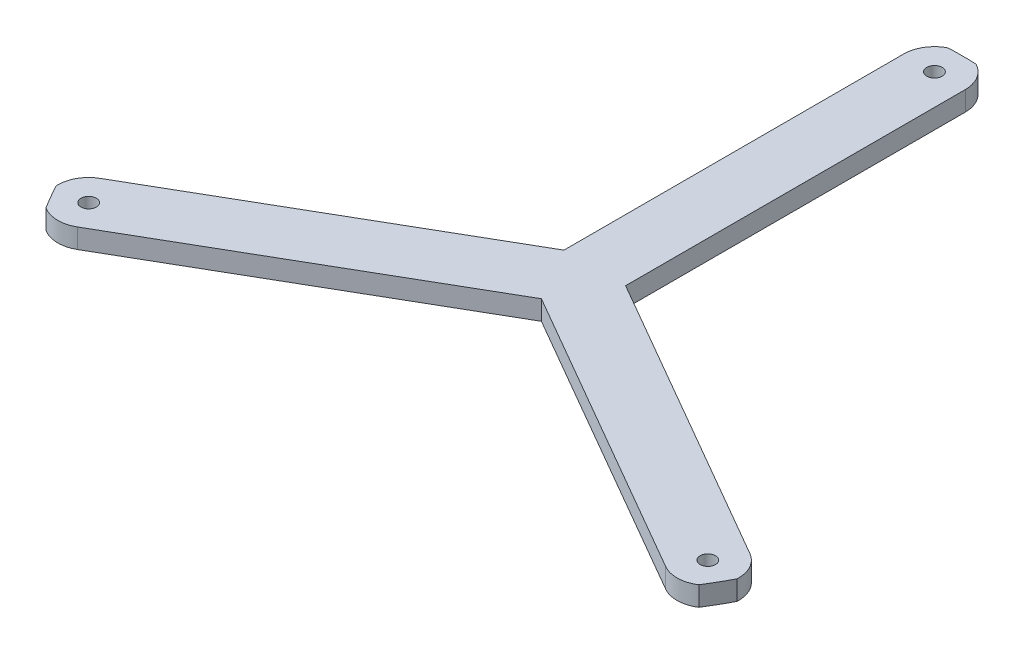
ISO-10303-21;
HEADER;
FILE_DESCRIPTION(('STEP AP214'),'2;1');
FILE_NAME('part.step','',(''),(''),'','','');
FILE_SCHEMA(('AUTOMOTIVE_DESIGN { 1 0 10303 214 1 1 1 1 }'));
ENDSEC;
DATA;
#1=APPLICATION_CONTEXT('core data for automotive mechanical design processes');
#2=APPLICATION_PROTOCOL_DEFINITION('international standard','automotive_design',2000,#1);
#3=PRODUCT_CONTEXT('',#1,'mechanical');
#4=PRODUCT('Part','Part','',(#3));
#5=PRODUCT_RELATED_PRODUCT_CATEGORY('part','',(#4));
#6=PRODUCT_DEFINITION_FORMATION('','',#4);
#7=PRODUCT_DEFINITION_CONTEXT('part definition',#1,'design');
#8=PRODUCT_DEFINITION('design','',#6,#7);
#9=PRODUCT_DEFINITION_SHAPE('','',#8);
#10=(LENGTH_UNIT() NAMED_UNIT(*) SI_UNIT(.MILLI.,.METRE.));
#11=(NAMED_UNIT(*) PLANE_ANGLE_UNIT() SI_UNIT($,.RADIAN.));
#12=(NAMED_UNIT(*) SI_UNIT($,.STERADIAN.) SOLID_ANGLE_UNIT());
#13=UNCERTAINTY_MEASURE_WITH_UNIT(LENGTH_MEASURE(1.E-05),#10,'distance_accuracy_value','');
#14=(GEOMETRIC_REPRESENTATION_CONTEXT(3) GLOBAL_UNCERTAINTY_ASSIGNED_CONTEXT((#13)) GLOBAL_UNIT_ASSIGNED_CONTEXT((#10,
#11,#12)) REPRESENTATION_CONTEXT('',''));
#15=CARTESIAN_POINT('',(0.,0.,0.));
#16=DIRECTION('',(0.,0.,1.));
#17=DIRECTION('',(1.,0.,0.));
#18=AXIS2_PLACEMENT_3D('',#15,#16,#17);
#19=CARTESIAN_POINT('',(0.,6.35,0.));
#20=DIRECTION('',(0.,-1.,0.));
#21=DIRECTION('',(0.,0.,-1.));
#22=AXIS2_PLACEMENT_3D('',#19,#20,#21);
#23=CYLINDRICAL_SURFACE('',#22,125.);
#24=DIRECTION('',(0.,1.,0.));
#25=VECTOR('',#24,1.);
#26=CARTESIAN_POINT('',(110.44429821998,-3.65,58.541070973259));
#27=LINE('',#26,#25);
#28=CARTESIAN_POINT('',(110.44429821998,0.,58.541070973259));
#29=VERTEX_POINT('',#28);
#30=CARTESIAN_POINT('',(110.44429821998,6.35,58.541070973259));
#31=VERTEX_POINT('',#30);
#32=EDGE_CURVE('E307',#29,#31,#27,.T.);
#33=ORIENTED_EDGE('',*,*,#32,.T.);
#34=CARTESIAN_POINT('',(0.,6.35,0.));
#35=DIRECTION('',(0.,1.,0.));
#36=DIRECTION('',(0.,0.,1.));
#37=AXIS2_PLACEMENT_3D('',#34,#35,#36);
#38=CIRCLE('',#37,125.);
#39=CARTESIAN_POINT('',(105.92020373756,6.35,66.3770324750498));
#40=VERTEX_POINT('',#39);
#41=EDGE_CURVE('E246',#40,#31,#38,.T.);
#42=ORIENTED_EDGE('',*,*,#41,.F.);
#43=DIRECTION('',(0.,1.,0.));
#44=VECTOR('',#43,1.);
#45=CARTESIAN_POINT('',(105.92020373756,-3.65,66.3770324750498));
#46=LINE('',#45,#44);
#47=CARTESIAN_POINT('',(105.92020373756,0.,66.3770324750498));
#48=VERTEX_POINT('',#47);
#49=EDGE_CURVE('E234',#48,#40,#46,.T.);
#50=ORIENTED_EDGE('',*,*,#49,.F.);
#51=CARTESIAN_POINT('',(0.,0.,0.));
#52=DIRECTION('',(0.,1.,0.));
#53=DIRECTION('',(0.,0.,1.));
#54=AXIS2_PLACEMENT_3D('',#51,#52,#53);
#55=CIRCLE('',#54,125.);
#56=EDGE_CURVE('E244',#48,#29,#55,.T.);
#57=ORIENTED_EDGE('',*,*,#56,.T.);
#58=EDGE_LOOP('',(#33,#42,#50,#57));
#59=FACE_BOUND('',#58,.T.);
#60=ADVANCED_FACE('F109',(#59),#23,.T.);
#61=DIRECTION('',(0.,1.,0.));
#62=VECTOR('',#61,1.);
#63=CARTESIAN_POINT('',(4.52409448241847,-3.65,-124.918103448276));
#64=LINE('',#63,#62);
#65=CARTESIAN_POINT('',(4.52409448241847,0.,-124.918103448276));
#66=VERTEX_POINT('',#65);
#67=CARTESIAN_POINT('',(4.52409448241847,6.35,-124.918103448276));
#68=VERTEX_POINT('',#67);
#69=EDGE_CURVE('E302',#66,#68,#64,.T.);
#70=ORIENTED_EDGE('',*,*,#69,.F.);
#71=CARTESIAN_POINT('',(-4.52409448241847,0.,-124.918103448276));
#72=VERTEX_POINT('',#71);
#73=EDGE_CURVE('E249',#66,#72,#55,.T.);
#74=ORIENTED_EDGE('',*,*,#73,.T.);
#75=DIRECTION('',(0.,1.,0.));
#76=VECTOR('',#75,1.);
#77=CARTESIAN_POINT('',(-4.52409448241847,-3.65,-124.918103448276));
#78=LINE('',#77,#76);
#79=CARTESIAN_POINT('',(-4.52409448241847,6.35,-124.918103448276));
#80=VERTEX_POINT('',#79);
#81=EDGE_CURVE('E324',#72,#80,#78,.T.);
#82=ORIENTED_EDGE('',*,*,#81,.T.);
#83=EDGE_CURVE('E243',#68,#80,#38,.T.);
#84=ORIENTED_EDGE('',*,*,#83,.F.);
#85=EDGE_LOOP('',(#70,#74,#82,#84));
#86=FACE_BOUND('',#85,.T.);
#87=ADVANCED_FACE('F365',(#86),#23,.T.);
#88=DIRECTION('',(0.,1.,0.));
#89=VECTOR('',#88,1.);
#90=CARTESIAN_POINT('',(-105.92020373759,-3.65,66.377032475001));
#91=LINE('',#90,#89);
#92=CARTESIAN_POINT('',(-105.92020373759,0.,66.377032475001));
#93=VERTEX_POINT('',#92);
#94=CARTESIAN_POINT('',(-105.92020373759,6.35,66.377032475001));
#95=VERTEX_POINT('',#94);
#96=EDGE_CURVE('E216',#93,#95,#91,.T.);
#97=ORIENTED_EDGE('',*,*,#96,.T.);
#98=CARTESIAN_POINT('',(-110.444298220006,6.35,58.5410709732088));
#99=VERTEX_POINT('',#98);
#100=EDGE_CURVE('E231',#99,#95,#38,.T.);
#101=ORIENTED_EDGE('',*,*,#100,.F.);
#102=DIRECTION('',(0.,1.,0.));
#103=VECTOR('',#102,1.);
#104=CARTESIAN_POINT('',(-110.444298220006,-3.65,58.5410709732088));
#105=LINE('',#104,#103);
#106=CARTESIAN_POINT('',(-110.444298220006,0.,58.5410709732088));
#107=VERTEX_POINT('',#106);
#108=EDGE_CURVE('E321',#107,#99,#105,.T.);
#109=ORIENTED_EDGE('',*,*,#108,.F.);
#110=EDGE_CURVE('E233',#107,#93,#55,.T.);
#111=ORIENTED_EDGE('',*,*,#110,.T.);
#112=EDGE_LOOP('',(#97,#101,#109,#111));
#113=FACE_BOUND('',#112,.T.);
#114=ADVANCED_FACE('F229',(#113),#23,.T.);
#115=CARTESIAN_POINT('',(0.,6.35,0.));
#116=DIRECTION('',(0.,1.,0.));
#117=DIRECTION('',(0.,0.,1.));
#118=AXIS2_PLACEMENT_3D('',#115,#116,#117);
#119=PLANE('',#118);
#120=CARTESIAN_POINT('',(0.,6.35,-116.));
#121=DIRECTION('',(0.,1.,0.));
#122=DIRECTION('',(0.,0.,1.));
#123=AXIS2_PLACEMENT_3D('',#120,#121,#122);
#124=CIRCLE('',#123,2.5);
#125=CARTESIAN_POINT('',(0.,6.35,-113.5));
#126=VERTEX_POINT('',#125);
#127=EDGE_CURVE('E335',#126,#126,#124,.T.);
#128=ORIENTED_EDGE('',*,*,#127,.F.);
#129=EDGE_LOOP('',(#128));
#130=FACE_BOUND('',#129,.T.);
#131=CARTESIAN_POINT('',(100.458946838986,6.35,58.0000000000153));
#132=DIRECTION('',(0.,1.,0.));
#133=DIRECTION('',(0.,0.,1.));
#134=AXIS2_PLACEMENT_3D('',#131,#132,#133);
#135=CIRCLE('',#134,2.5);
#136=CARTESIAN_POINT('',(100.458946838986,6.35,60.5000000000153));
#137=VERTEX_POINT('',#136);
#138=EDGE_CURVE('E338',#137,#137,#135,.T.);
#139=ORIENTED_EDGE('',*,*,#138,.F.);
#140=EDGE_LOOP('',(#139));
#141=FACE_BOUND('',#140,.T.);
#142=CARTESIAN_POINT('',(-100.458946839013,6.35,57.9999999999694));
#143=DIRECTION('',(0.,1.,0.));
#144=DIRECTION('',(0.,0.,1.));
#145=AXIS2_PLACEMENT_3D('',#142,#143,#144);
#146=CIRCLE('',#145,2.5);
#147=CARTESIAN_POINT('',(-100.458946839013,6.35,60.4999999999693));
#148=VERTEX_POINT('',#147);
#149=EDGE_CURVE('E344',#148,#148,#146,.T.);
#150=ORIENTED_EDGE('',*,*,#149,.F.);
#151=EDGE_LOOP('',(#150));
#152=FACE_BOUND('',#151,.T.);
#153=ORIENTED_EDGE('',*,*,#41,.T.);
#154=CARTESIAN_POINT('',(100.458946838986,6.35,58.0000000000153));
#155=DIRECTION('',(0.,1.,0.));
#156=DIRECTION('',(0.,0.,1.));
#157=AXIS2_PLACEMENT_3D('',#154,#155,#156);
#158=CIRCLE('',#157,10.);
#159=CARTESIAN_POINT('',(105.458946838987,6.35,49.3397459621717));
#160=VERTEX_POINT('',#159);
#161=EDGE_CURVE('E377',#31,#160,#158,.T.);
#162=ORIENTED_EDGE('',*,*,#161,.T.);
#163=DIRECTION('',(0.866025403784362,0.,0.500000000000132));
#164=VECTOR('',#163,1.);
#165=CARTESIAN_POINT('',(5.00000000000132,6.35,-8.66025403784362));
#166=LINE('',#165,#164);
#167=CARTESIAN_POINT('',(10.,6.35,-5.77350269189523));
#168=VERTEX_POINT('',#167);
#169=EDGE_CURVE('E310',#168,#160,#166,.T.);
#170=ORIENTED_EDGE('',*,*,#169,.F.);
#171=DIRECTION('',(0.,0.,1.));
#172=VECTOR('',#171,1.);
#173=CARTESIAN_POINT('',(10.,6.35,0.));
#174=LINE('',#173,#172);
#175=CARTESIAN_POINT('',(9.99999999999999,6.35,-116.));
#176=VERTEX_POINT('',#175);
#177=EDGE_CURVE('E298',#176,#168,#174,.T.);
#178=ORIENTED_EDGE('',*,*,#177,.F.);
#179=CARTESIAN_POINT('',(0.,6.35,-116.));
#180=DIRECTION('',(0.,1.,0.));
#181=DIRECTION('',(0.,0.,1.));
#182=AXIS2_PLACEMENT_3D('',#179,#180,#181);
#183=CIRCLE('',#182,9.99999999999999);
#184=EDGE_CURVE('E378',#176,#68,#183,.T.);
#185=ORIENTED_EDGE('',*,*,#184,.T.);
#186=ORIENTED_EDGE('',*,*,#83,.T.);
#187=CARTESIAN_POINT('',(0.,6.35,-116.));
#188=DIRECTION('',(0.,1.,0.));
#189=DIRECTION('',(0.,0.,1.));
#190=AXIS2_PLACEMENT_3D('',#187,#188,#189);
#191=CIRCLE('',#190,9.99999999999999);
#192=CARTESIAN_POINT('',(-9.99999999999999,6.35,-116.));
#193=VERTEX_POINT('',#192);
#194=EDGE_CURVE('E317',#80,#193,#191,.T.);
#195=ORIENTED_EDGE('',*,*,#194,.T.);
#196=DIRECTION('',(0.,0.,1.));
#197=VECTOR('',#196,1.);
#198=CARTESIAN_POINT('',(-9.99999999999998,6.35,0.));
#199=LINE('',#198,#197);
#200=CARTESIAN_POINT('',(-9.99999999999997,6.35,-5.7735026918983));
#201=VERTEX_POINT('',#200);
#202=EDGE_CURVE('E314',#193,#201,#199,.T.);
#203=ORIENTED_EDGE('',*,*,#202,.T.);
#204=DIRECTION('',(-0.866025403784591,0.,0.499999999999736));
#205=VECTOR('',#204,1.);
#206=CARTESIAN_POINT('',(-4.99999999999736,6.35,-8.66025403784591));
#207=LINE('',#206,#205);
#208=CARTESIAN_POINT('',(-105.45894683901,6.35,49.3397459621235));
#209=VERTEX_POINT('',#208);
#210=EDGE_CURVE('E312',#201,#209,#207,.T.);
#211=ORIENTED_EDGE('',*,*,#210,.T.);
#212=CARTESIAN_POINT('',(-100.458946839013,6.35,57.9999999999694));
#213=DIRECTION('',(0.,1.,0.));
#214=DIRECTION('',(0.,0.,1.));
#215=AXIS2_PLACEMENT_3D('',#212,#213,#214);
#216=CIRCLE('',#215,10.);
#217=EDGE_CURVE('E242',#209,#99,#216,.T.);
#218=ORIENTED_EDGE('',*,*,#217,.T.);
#219=ORIENTED_EDGE('',*,*,#100,.T.);
#220=CARTESIAN_POINT('',(-100.458946839013,6.35,57.9999999999694));
#221=DIRECTION('',(0.,1.,0.));
#222=DIRECTION('',(0.,0.,1.));
#223=AXIS2_PLACEMENT_3D('',#220,#221,#222);
#224=CIRCLE('',#223,10.);
#225=CARTESIAN_POINT('',(-95.4589468390152,6.35,66.6602540378153));
#226=VERTEX_POINT('',#225);
#227=EDGE_CURVE('E213',#95,#226,#224,.T.);
#228=ORIENTED_EDGE('',*,*,#227,.T.);
#229=DIRECTION('',(-0.866025403784591,0.,0.499999999999736));
#230=VECTOR('',#229,1.);
#231=CARTESIAN_POINT('',(4.99999999999736,6.35,8.66025403784592));
#232=LINE('',#231,#230);
#233=CARTESIAN_POINT('',(-2.63461127913978E-12,6.35,11.547005383792));
#234=VERTEX_POINT('',#233);
#235=EDGE_CURVE('E235',#234,#226,#232,.T.);
#236=ORIENTED_EDGE('',*,*,#235,.F.);
#237=DIRECTION('',(0.866025403784362,0.,0.500000000000132));
#238=VECTOR('',#237,1.);
#239=CARTESIAN_POINT('',(-5.00000000000132,6.35,8.66025403784362));
#240=LINE('',#239,#238);
#241=CARTESIAN_POINT('',(95.4589468389847,6.35,66.6602540378589));
#242=VERTEX_POINT('',#241);
#243=EDGE_CURVE('E409',#234,#242,#240,.T.);
#244=ORIENTED_EDGE('',*,*,#243,.T.);
#245=CARTESIAN_POINT('',(100.458946838986,6.35,58.0000000000153));
#246=DIRECTION('',(0.,1.,0.));
#247=DIRECTION('',(0.,0.,1.));
#248=AXIS2_PLACEMENT_3D('',#245,#246,#247);
#249=CIRCLE('',#248,10.);
#250=EDGE_CURVE('E224',#242,#40,#249,.T.);
#251=ORIENTED_EDGE('',*,*,#250,.T.);
#252=EDGE_LOOP('',(#153,#162,#170,#178,#185,#186,#195,#203,#211,#218,#219,#228,#236,#244,#251));
#253=FACE_BOUND('',#252,.T.);
#254=ADVANCED_FACE('F239',(#130,#141,#152,#253),#119,.T.);
#255=CARTESIAN_POINT('',(0.,0.,0.));
#256=DIRECTION('',(0.,1.,0.));
#257=DIRECTION('',(0.,0.,1.));
#258=AXIS2_PLACEMENT_3D('',#255,#256,#257);
#259=PLANE('',#258);
#260=CARTESIAN_POINT('',(-100.458946839013,0.,57.9999999999694));
#261=DIRECTION('',(0.,1.,0.));
#262=DIRECTION('',(0.,0.,1.));
#263=AXIS2_PLACEMENT_3D('',#260,#261,#262);
#264=CIRCLE('',#263,2.5);
#265=CARTESIAN_POINT('',(-100.458946839013,0.,60.4999999999693));
#266=VERTEX_POINT('',#265);
#267=EDGE_CURVE('E323',#266,#266,#264,.T.);
#268=ORIENTED_EDGE('',*,*,#267,.T.);
#269=EDGE_LOOP('',(#268));
#270=FACE_BOUND('',#269,.T.);
#271=CARTESIAN_POINT('',(100.458946838986,0.,58.0000000000153));
#272=DIRECTION('',(0.,1.,0.));
#273=DIRECTION('',(0.,0.,1.));
#274=AXIS2_PLACEMENT_3D('',#271,#272,#273);
#275=CIRCLE('',#274,2.5);
#276=CARTESIAN_POINT('',(100.458946838986,0.,60.5000000000153));
#277=VERTEX_POINT('',#276);
#278=EDGE_CURVE('E341',#277,#277,#275,.T.);
#279=ORIENTED_EDGE('',*,*,#278,.T.);
#280=EDGE_LOOP('',(#279));
#281=FACE_BOUND('',#280,.T.);
#282=CARTESIAN_POINT('',(0.,0.,-116.));
#283=DIRECTION('',(0.,1.,0.));
#284=DIRECTION('',(0.,0.,1.));
#285=AXIS2_PLACEMENT_3D('',#282,#283,#284);
#286=CIRCLE('',#285,2.5);
#287=CARTESIAN_POINT('',(0.,0.,-113.5));
#288=VERTEX_POINT('',#287);
#289=EDGE_CURVE('E332',#288,#288,#286,.T.);
#290=ORIENTED_EDGE('',*,*,#289,.T.);
#291=EDGE_LOOP('',(#290));
#292=FACE_BOUND('',#291,.T.);
#293=CARTESIAN_POINT('',(100.458946838986,0.,58.0000000000153));
#294=DIRECTION('',(0.,1.,0.));
#295=DIRECTION('',(0.,0.,1.));
#296=AXIS2_PLACEMENT_3D('',#293,#294,#295);
#297=CIRCLE('',#296,10.);
#298=CARTESIAN_POINT('',(105.458946838987,0.,49.3397459621717));
#299=VERTEX_POINT('',#298);
#300=EDGE_CURVE('E12',#29,#299,#297,.T.);
#301=ORIENTED_EDGE('',*,*,#300,.F.);
#302=ORIENTED_EDGE('',*,*,#56,.F.);
#303=CARTESIAN_POINT('',(100.458946838986,0.,58.0000000000153));
#304=DIRECTION('',(0.,1.,0.));
#305=DIRECTION('',(0.,0.,1.));
#306=AXIS2_PLACEMENT_3D('',#303,#304,#305);
#307=CIRCLE('',#306,10.);
#308=CARTESIAN_POINT('',(95.4589468389847,0.,66.6602540378589));
#309=VERTEX_POINT('',#308);
#310=EDGE_CURVE('E268',#309,#48,#307,.T.);
#311=ORIENTED_EDGE('',*,*,#310,.F.);
#312=DIRECTION('',(0.866025403784362,0.,0.500000000000132));
#313=VECTOR('',#312,1.);
#314=CARTESIAN_POINT('',(-5.00000000000132,0.,8.66025403784362));
#315=LINE('',#314,#313);
#316=CARTESIAN_POINT('',(-2.63461127913978E-12,0.,11.547005383792));
#317=VERTEX_POINT('',#316);
#318=EDGE_CURVE('E270',#317,#309,#315,.T.);
#319=ORIENTED_EDGE('',*,*,#318,.F.);
#320=DIRECTION('',(-0.866025403784591,0.,0.499999999999736));
#321=VECTOR('',#320,1.);
#322=CARTESIAN_POINT('',(4.99999999999736,0.,8.66025403784592));
#323=LINE('',#322,#321);
#324=CARTESIAN_POINT('',(-95.4589468390152,0.,66.6602540378153));
#325=VERTEX_POINT('',#324);
#326=EDGE_CURVE('E272',#317,#325,#323,.T.);
#327=ORIENTED_EDGE('',*,*,#326,.T.);
#328=CARTESIAN_POINT('',(-100.458946839013,0.,57.9999999999694));
#329=DIRECTION('',(0.,1.,0.));
#330=DIRECTION('',(0.,0.,1.));
#331=AXIS2_PLACEMENT_3D('',#328,#329,#330);
#332=CIRCLE('',#331,10.);
#333=EDGE_CURVE('E275',#93,#325,#332,.T.);
#334=ORIENTED_EDGE('',*,*,#333,.F.);
#335=ORIENTED_EDGE('',*,*,#110,.F.);
#336=CARTESIAN_POINT('',(-100.458946839013,0.,57.9999999999694));
#337=DIRECTION('',(0.,1.,0.));
#338=DIRECTION('',(0.,0.,1.));
#339=AXIS2_PLACEMENT_3D('',#336,#337,#338);
#340=CIRCLE('',#339,10.);
#341=CARTESIAN_POINT('',(-105.45894683901,0.,49.3397459621235));
#342=VERTEX_POINT('',#341);
#343=EDGE_CURVE('E266',#342,#107,#340,.T.);
#344=ORIENTED_EDGE('',*,*,#343,.F.);
#345=DIRECTION('',(-0.866025403784591,0.,0.499999999999736));
#346=VECTOR('',#345,1.);
#347=CARTESIAN_POINT('',(-4.99999999999736,0.,-8.66025403784591));
#348=LINE('',#347,#346);
#349=CARTESIAN_POINT('',(-9.99999999999997,0.,-5.7735026918983));
#350=VERTEX_POINT('',#349);
#351=EDGE_CURVE('E252',#350,#342,#348,.T.);
#352=ORIENTED_EDGE('',*,*,#351,.F.);
#353=DIRECTION('',(0.,0.,1.));
#354=VECTOR('',#353,1.);
#355=CARTESIAN_POINT('',(-9.99999999999998,0.,0.));
#356=LINE('',#355,#354);
#357=CARTESIAN_POINT('',(-9.99999999999999,0.,-116.));
#358=VERTEX_POINT('',#357);
#359=EDGE_CURVE('E256',#358,#350,#356,.T.);
#360=ORIENTED_EDGE('',*,*,#359,.F.);
#361=CARTESIAN_POINT('',(0.,0.,-116.));
#362=DIRECTION('',(0.,1.,0.));
#363=DIRECTION('',(0.,0.,1.));
#364=AXIS2_PLACEMENT_3D('',#361,#362,#363);
#365=CIRCLE('',#364,9.99999999999999);
#366=EDGE_CURVE('E262',#72,#358,#365,.T.);
#367=ORIENTED_EDGE('',*,*,#366,.F.);
#368=ORIENTED_EDGE('',*,*,#73,.F.);
#369=CARTESIAN_POINT('',(0.,0.,-116.));
#370=DIRECTION('',(0.,1.,0.));
#371=DIRECTION('',(0.,0.,1.));
#372=AXIS2_PLACEMENT_3D('',#369,#370,#371);
#373=CIRCLE('',#372,9.99999999999999);
#374=CARTESIAN_POINT('',(9.99999999999999,0.,-116.));
#375=VERTEX_POINT('',#374);
#376=EDGE_CURVE('E277',#375,#66,#373,.T.);
#377=ORIENTED_EDGE('',*,*,#376,.F.);
#378=DIRECTION('',(0.,0.,1.));
#379=VECTOR('',#378,1.);
#380=CARTESIAN_POINT('',(10.,0.,0.));
#381=LINE('',#380,#379);
#382=CARTESIAN_POINT('',(10.,0.,-5.77350269189523));
#383=VERTEX_POINT('',#382);
#384=EDGE_CURVE('E279',#375,#383,#381,.T.);
#385=ORIENTED_EDGE('',*,*,#384,.T.);
#386=DIRECTION('',(0.866025403784362,0.,0.500000000000132));
#387=VECTOR('',#386,1.);
#388=CARTESIAN_POINT('',(5.00000000000132,0.,-8.66025403784362));
#389=LINE('',#388,#387);
#390=EDGE_CURVE('E116',#383,#299,#389,.T.);
#391=ORIENTED_EDGE('',*,*,#390,.T.);
#392=EDGE_LOOP('',(#301,#302,#311,#319,#327,#334,#335,#344,#352,#360,#367,#368,#377,#385,#391));
#393=FACE_BOUND('',#392,.T.);
#394=ADVANCED_FACE('F284',(#270,#281,#292,#393),#259,.F.);
#395=CARTESIAN_POINT('',(-100.458946839013,0.,57.9999999999694));
#396=DIRECTION('',(0.,1.,0.));
#397=DIRECTION('',(0.,0.,1.));
#398=AXIS2_PLACEMENT_3D('',#395,#396,#397);
#399=CYLINDRICAL_SURFACE('',#398,2.5);
#400=ORIENTED_EDGE('',*,*,#267,.F.);
#401=EDGE_LOOP('',(#400));
#402=FACE_BOUND('',#401,.T.);
#403=ORIENTED_EDGE('',*,*,#149,.T.);
#404=EDGE_LOOP('',(#403));
#405=FACE_BOUND('',#404,.T.);
#406=ADVANCED_FACE('F351',(#402,#405),#399,.F.);
#407=CARTESIAN_POINT('',(100.458946838986,0.,58.0000000000153));
#408=DIRECTION('',(0.,1.,0.));
#409=DIRECTION('',(0.,0.,1.));
#410=AXIS2_PLACEMENT_3D('',#407,#408,#409);
#411=CYLINDRICAL_SURFACE('',#410,2.5);
#412=ORIENTED_EDGE('',*,*,#278,.F.);
#413=EDGE_LOOP('',(#412));
#414=FACE_BOUND('',#413,.T.);
#415=ORIENTED_EDGE('',*,*,#138,.T.);
#416=EDGE_LOOP('',(#415));
#417=FACE_BOUND('',#416,.T.);
#418=ADVANCED_FACE('F354',(#414,#417),#411,.F.);
#419=CARTESIAN_POINT('',(0.,0.,-116.));
#420=DIRECTION('',(0.,1.,0.));
#421=DIRECTION('',(0.,0.,1.));
#422=AXIS2_PLACEMENT_3D('',#419,#420,#421);
#423=CYLINDRICAL_SURFACE('',#422,2.5);
#424=ORIENTED_EDGE('',*,*,#289,.F.);
#425=EDGE_LOOP('',(#424));
#426=FACE_BOUND('',#425,.T.);
#427=ORIENTED_EDGE('',*,*,#127,.T.);
#428=EDGE_LOOP('',(#427));
#429=FACE_BOUND('',#428,.T.);
#430=ADVANCED_FACE('F447',(#426,#429),#423,.F.);
#431=CARTESIAN_POINT('',(-100.458946839013,-3.65,57.9999999999694));
#432=DIRECTION('',(0.,1.,0.));
#433=DIRECTION('',(0.,0.,1.));
#434=AXIS2_PLACEMENT_3D('',#431,#432,#433);
#435=CYLINDRICAL_SURFACE('',#434,10.);
#436=ORIENTED_EDGE('',*,*,#343,.T.);
#437=ORIENTED_EDGE('',*,*,#108,.T.);
#438=ORIENTED_EDGE('',*,*,#217,.F.);
#439=DIRECTION('',(0.,1.,0.));
#440=VECTOR('',#439,1.);
#441=CARTESIAN_POINT('',(-105.45894683901,-3.65,49.3397459621235));
#442=LINE('',#441,#440);
#443=EDGE_CURVE('E320',#342,#209,#442,.T.);
#444=ORIENTED_EDGE('',*,*,#443,.F.);
#445=EDGE_LOOP('',(#436,#437,#438,#444));
#446=FACE_BOUND('',#445,.T.);
#447=ADVANCED_FACE('F402',(#446),#435,.T.);
#448=CARTESIAN_POINT('',(0.,-3.65,-116.));
#449=DIRECTION('',(0.,1.,0.));
#450=DIRECTION('',(0.,0.,1.));
#451=AXIS2_PLACEMENT_3D('',#448,#449,#450);
#452=CYLINDRICAL_SURFACE('',#451,9.99999999999999);
#453=ORIENTED_EDGE('',*,*,#366,.T.);
#454=DIRECTION('',(0.,1.,0.));
#455=VECTOR('',#454,1.);
#456=CARTESIAN_POINT('',(-9.99999999999999,-3.65,-116.));
#457=LINE('',#456,#455);
#458=EDGE_CURVE('E327',#358,#193,#457,.T.);
#459=ORIENTED_EDGE('',*,*,#458,.T.);
#460=ORIENTED_EDGE('',*,*,#194,.F.);
#461=ORIENTED_EDGE('',*,*,#81,.F.);
#462=EDGE_LOOP('',(#453,#459,#460,#461));
#463=FACE_BOUND('',#462,.T.);
#464=ADVANCED_FACE('F392',(#463),#452,.T.);
#465=CARTESIAN_POINT('',(-9.99999999999998,-3.65,0.));
#466=DIRECTION('',(-1.,0.,0.));
#467=DIRECTION('',(0.,0.,1.));
#468=AXIS2_PLACEMENT_3D('',#465,#466,#467);
#469=PLANE('',#468);
#470=ORIENTED_EDGE('',*,*,#359,.T.);
#471=DIRECTION('',(0.,1.,0.));
#472=VECTOR('',#471,1.);
#473=CARTESIAN_POINT('',(-9.99999999999997,-3.65,-5.7735026918983));
#474=LINE('',#473,#472);
#475=EDGE_CURVE('E329',#350,#201,#474,.T.);
#476=ORIENTED_EDGE('',*,*,#475,.T.);
#477=ORIENTED_EDGE('',*,*,#202,.F.);
#478=ORIENTED_EDGE('',*,*,#458,.F.);
#479=EDGE_LOOP('',(#470,#476,#477,#478));
#480=FACE_BOUND('',#479,.T.);
#481=ADVANCED_FACE('F397',(#480),#469,.T.);
#482=CARTESIAN_POINT('',(-4.99999999999736,-3.65,-8.66025403784591));
#483=DIRECTION('',(-0.499999999999736,0.,-0.866025403784591));
#484=DIRECTION('',(-0.866025403784591,0.,0.499999999999736));
#485=AXIS2_PLACEMENT_3D('',#482,#483,#484);
#486=PLANE('',#485);
#487=ORIENTED_EDGE('',*,*,#351,.T.);
#488=ORIENTED_EDGE('',*,*,#443,.T.);
#489=ORIENTED_EDGE('',*,*,#210,.F.);
#490=ORIENTED_EDGE('',*,*,#475,.F.);
#491=EDGE_LOOP('',(#487,#488,#489,#490));
#492=FACE_BOUND('',#491,.T.);
#493=ADVANCED_FACE('F400',(#492),#486,.T.);
#494=CARTESIAN_POINT('',(-100.458946839013,-3.65,57.9999999999694));
#495=DIRECTION('',(0.,1.,0.));
#496=DIRECTION('',(0.,0.,1.));
#497=AXIS2_PLACEMENT_3D('',#494,#495,#496);
#498=CYLINDRICAL_SURFACE('',#497,10.);
#499=ORIENTED_EDGE('',*,*,#333,.T.);
#500=DIRECTION('',(0.,1.,0.));
#501=VECTOR('',#500,1.);
#502=CARTESIAN_POINT('',(-95.4589468390152,-3.65,66.6602540378153));
#503=LINE('',#502,#501);
#504=EDGE_CURVE('E219',#325,#226,#503,.T.);
#505=ORIENTED_EDGE('',*,*,#504,.T.);
#506=ORIENTED_EDGE('',*,*,#227,.F.);
#507=ORIENTED_EDGE('',*,*,#96,.F.);
#508=EDGE_LOOP('',(#499,#505,#506,#507));
#509=FACE_BOUND('',#508,.T.);
#510=ADVANCED_FACE('F215',(#509),#498,.T.);
#511=CARTESIAN_POINT('',(4.99999999999736,-3.65,8.66025403784592));
#512=DIRECTION('',(-0.499999999999736,0.,-0.866025403784591));
#513=DIRECTION('',(-0.866025403784591,0.,0.499999999999736));
#514=AXIS2_PLACEMENT_3D('',#511,#512,#513);
#515=PLANE('',#514);
#516=DIRECTION('',(0.,1.,0.));
#517=VECTOR('',#516,1.);
#518=CARTESIAN_POINT('',(-2.63461127913978E-12,-3.65,11.547005383792));
#519=LINE('',#518,#517);
#520=EDGE_CURVE('E382',#317,#234,#519,.T.);
#521=ORIENTED_EDGE('',*,*,#520,.T.);
#522=ORIENTED_EDGE('',*,*,#235,.T.);
#523=ORIENTED_EDGE('',*,*,#504,.F.);
#524=ORIENTED_EDGE('',*,*,#326,.F.);
#525=EDGE_LOOP('',(#521,#522,#523,#524));
#526=FACE_BOUND('',#525,.T.);
#527=ADVANCED_FACE('F405',(#526),#515,.F.);
#528=CARTESIAN_POINT('',(-5.00000000000132,-3.65,8.66025403784362));
#529=DIRECTION('',(-0.500000000000132,0.,0.866025403784363));
#530=DIRECTION('',(0.866025403784362,0.,0.500000000000132));
#531=AXIS2_PLACEMENT_3D('',#528,#529,#530);
#532=PLANE('',#531);
#533=ORIENTED_EDGE('',*,*,#318,.T.);
#534=DIRECTION('',(0.,1.,0.));
#535=VECTOR('',#534,1.);
#536=CARTESIAN_POINT('',(95.4589468389847,-3.65,66.6602540378589));
#537=LINE('',#536,#535);
#538=EDGE_CURVE('E131',#309,#242,#537,.T.);
#539=ORIENTED_EDGE('',*,*,#538,.T.);
#540=ORIENTED_EDGE('',*,*,#243,.F.);
#541=ORIENTED_EDGE('',*,*,#520,.F.);
#542=EDGE_LOOP('',(#533,#539,#540,#541));
#543=FACE_BOUND('',#542,.T.);
#544=ADVANCED_FACE('F418',(#543),#532,.T.);
#545=CARTESIAN_POINT('',(100.458946838986,-3.65,58.0000000000153));
#546=DIRECTION('',(0.,1.,0.));
#547=DIRECTION('',(0.,0.,1.));
#548=AXIS2_PLACEMENT_3D('',#545,#546,#547);
#549=CYLINDRICAL_SURFACE('',#548,10.);
#550=ORIENTED_EDGE('',*,*,#310,.T.);
#551=ORIENTED_EDGE('',*,*,#49,.T.);
#552=ORIENTED_EDGE('',*,*,#250,.F.);
#553=ORIENTED_EDGE('',*,*,#538,.F.);
#554=EDGE_LOOP('',(#550,#551,#552,#553));
#555=FACE_BOUND('',#554,.T.);
#556=ADVANCED_FACE('F415',(#555),#549,.T.);
#557=CARTESIAN_POINT('',(100.458946838986,-3.65,58.0000000000153));
#558=DIRECTION('',(0.,1.,0.));
#559=DIRECTION('',(0.,0.,1.));
#560=AXIS2_PLACEMENT_3D('',#557,#558,#559);
#561=CYLINDRICAL_SURFACE('',#560,10.);
#562=ORIENTED_EDGE('',*,*,#300,.T.);
#563=DIRECTION('',(0.,1.,0.));
#564=VECTOR('',#563,1.);
#565=CARTESIAN_POINT('',(105.458946838987,-3.65,49.3397459621717));
#566=LINE('',#565,#564);
#567=EDGE_CURVE('E294',#299,#160,#566,.T.);
#568=ORIENTED_EDGE('',*,*,#567,.T.);
#569=ORIENTED_EDGE('',*,*,#161,.F.);
#570=ORIENTED_EDGE('',*,*,#32,.F.);
#571=EDGE_LOOP('',(#562,#568,#569,#570));
#572=FACE_BOUND('',#571,.T.);
#573=ADVANCED_FACE('F376',(#572),#561,.T.);
#574=CARTESIAN_POINT('',(5.00000000000132,-3.65,-8.66025403784362));
#575=DIRECTION('',(-0.500000000000132,0.,0.866025403784363));
#576=DIRECTION('',(0.866025403784362,0.,0.500000000000132));
#577=AXIS2_PLACEMENT_3D('',#574,#575,#576);
#578=PLANE('',#577);
#579=DIRECTION('',(0.,1.,0.));
#580=VECTOR('',#579,1.);
#581=CARTESIAN_POINT('',(10.,-3.65,-5.77350269189523));
#582=LINE('',#581,#580);
#583=EDGE_CURVE('E292',#383,#168,#582,.T.);
#584=ORIENTED_EDGE('',*,*,#583,.T.);
#585=ORIENTED_EDGE('',*,*,#169,.T.);
#586=ORIENTED_EDGE('',*,*,#567,.F.);
#587=ORIENTED_EDGE('',*,*,#390,.F.);
#588=EDGE_LOOP('',(#584,#585,#586,#587));
#589=FACE_BOUND('',#588,.T.);
#590=ADVANCED_FACE('F290',(#589),#578,.F.);
#591=CARTESIAN_POINT('',(10.,-3.65,0.));
#592=DIRECTION('',(-1.,0.,0.));
#593=DIRECTION('',(0.,0.,1.));
#594=AXIS2_PLACEMENT_3D('',#591,#592,#593);
#595=PLANE('',#594);
#596=DIRECTION('',(0.,1.,0.));
#597=VECTOR('',#596,1.);
#598=CARTESIAN_POINT('',(9.99999999999999,-3.65,-116.));
#599=LINE('',#598,#597);
#600=EDGE_CURVE('E123',#375,#176,#599,.T.);
#601=ORIENTED_EDGE('',*,*,#600,.T.);
#602=ORIENTED_EDGE('',*,*,#177,.T.);
#603=ORIENTED_EDGE('',*,*,#583,.F.);
#604=ORIENTED_EDGE('',*,*,#384,.F.);
#605=EDGE_LOOP('',(#601,#602,#603,#604));
#606=FACE_BOUND('',#605,.T.);
#607=ADVANCED_FACE('F296',(#606),#595,.F.);
#608=CARTESIAN_POINT('',(0.,-3.65,-116.));
#609=DIRECTION('',(0.,1.,0.));
#610=DIRECTION('',(0.,0.,1.));
#611=AXIS2_PLACEMENT_3D('',#608,#609,#610);
#612=CYLINDRICAL_SURFACE('',#611,9.99999999999999);
#613=ORIENTED_EDGE('',*,*,#376,.T.);
#614=ORIENTED_EDGE('',*,*,#69,.T.);
#615=ORIENTED_EDGE('',*,*,#184,.F.);
#616=ORIENTED_EDGE('',*,*,#600,.F.);
#617=EDGE_LOOP('',(#613,#614,#615,#616));
#618=FACE_BOUND('',#617,.T.);
#619=ADVANCED_FACE('F434',(#618),#612,.T.);
#620=CLOSED_SHELL('',(#60,#87,#114,#254,#394,#406,#418,#430,#447,#464,#481,#493,#510,#527,#544,
#556,#573,#590,#607,#619));
#621=MANIFOLD_SOLID_BREP('B2',#620);
#622=ADVANCED_BREP_SHAPE_REPRESENTATION('',(#18,#621),#14);
#623=SHAPE_DEFINITION_REPRESENTATION(#9,#622);
ENDSEC;
END-ISO-10303-21;
